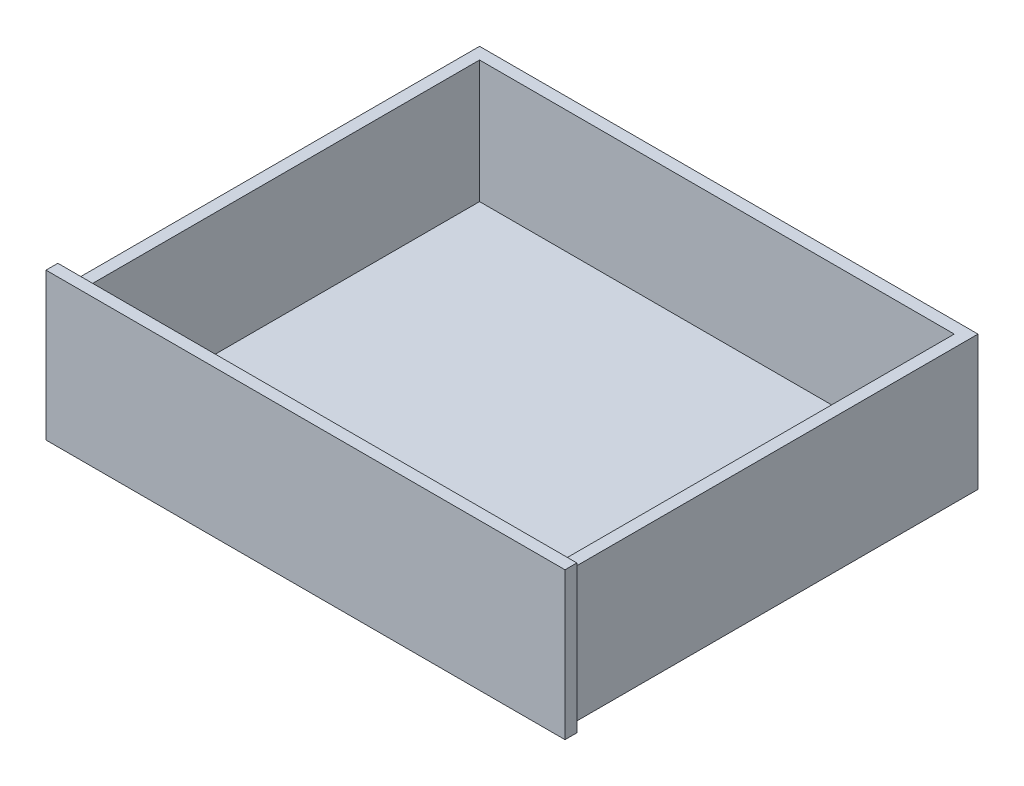
ISO-10303-21;
HEADER;
FILE_DESCRIPTION(('STEP AP214'),'2;1');
FILE_NAME('part.step','',(''),(''),'','','');
FILE_SCHEMA(('AUTOMOTIVE_DESIGN { 1 0 10303 214 1 1 1 1 }'));
ENDSEC;
DATA;
#1=APPLICATION_CONTEXT('core data for automotive mechanical design processes');
#2=APPLICATION_PROTOCOL_DEFINITION('international standard','automotive_design',2000,#1);
#3=PRODUCT_CONTEXT('',#1,'mechanical');
#4=PRODUCT('Part','Part','',(#3));
#5=PRODUCT_RELATED_PRODUCT_CATEGORY('part','',(#4));
#6=PRODUCT_DEFINITION_FORMATION('','',#4);
#7=PRODUCT_DEFINITION_CONTEXT('part definition',#1,'design');
#8=PRODUCT_DEFINITION('design','',#6,#7);
#9=PRODUCT_DEFINITION_SHAPE('','',#8);
#10=(LENGTH_UNIT() NAMED_UNIT(*) SI_UNIT(.MILLI.,.METRE.));
#11=(NAMED_UNIT(*) PLANE_ANGLE_UNIT() SI_UNIT($,.RADIAN.));
#12=(NAMED_UNIT(*) SI_UNIT($,.STERADIAN.) SOLID_ANGLE_UNIT());
#13=UNCERTAINTY_MEASURE_WITH_UNIT(LENGTH_MEASURE(1.E-05),#10,'distance_accuracy_value','');
#14=(GEOMETRIC_REPRESENTATION_CONTEXT(3) GLOBAL_UNCERTAINTY_ASSIGNED_CONTEXT((#13)) GLOBAL_UNIT_ASSIGNED_CONTEXT((#10,
#11,#12)) REPRESENTATION_CONTEXT('',''));
#15=CARTESIAN_POINT('',(0.,0.,0.));
#16=DIRECTION('',(0.,0.,1.));
#17=DIRECTION('',(1.,0.,0.));
#18=AXIS2_PLACEMENT_3D('',#15,#16,#17);
#19=CARTESIAN_POINT('',(0.,170.,0.));
#20=DIRECTION('',(0.,-1.,0.));
#21=DIRECTION('',(0.,0.,-1.));
#22=AXIS2_PLACEMENT_3D('',#19,#20,#21);
#23=PLANE('',#22);
#24=DIRECTION('',(0.,0.,-1.));
#25=VECTOR('',#24,1.);
#26=CARTESIAN_POINT('',(315.,170.,260.));
#27=LINE('',#26,#25);
#28=CARTESIAN_POINT('',(315.,170.,260.));
#29=VERTEX_POINT('',#28);
#30=CARTESIAN_POINT('',(315.,170.,-260.));
#31=VERTEX_POINT('',#30);
#32=EDGE_CURVE('E191',#29,#31,#27,.T.);
#33=ORIENTED_EDGE('',*,*,#32,.T.);
#34=DIRECTION('',(-1.,0.,0.));
#35=VECTOR('',#34,1.);
#36=CARTESIAN_POINT('',(-315.,170.,-260.));
#37=LINE('',#36,#35);
#38=CARTESIAN_POINT('',(-315.,170.,-260.));
#39=VERTEX_POINT('',#38);
#40=EDGE_CURVE('E82',#31,#39,#37,.T.);
#41=ORIENTED_EDGE('',*,*,#40,.T.);
#42=DIRECTION('',(0.,0.,1.));
#43=VECTOR('',#42,1.);
#44=CARTESIAN_POINT('',(-315.,170.,260.));
#45=LINE('',#44,#43);
#46=CARTESIAN_POINT('',(-315.,170.,260.));
#47=VERTEX_POINT('',#46);
#48=EDGE_CURVE('E195',#39,#47,#45,.T.);
#49=ORIENTED_EDGE('',*,*,#48,.T.);
#50=DIRECTION('',(1.,0.,0.));
#51=VECTOR('',#50,1.);
#52=CARTESIAN_POINT('',(-315.,170.,260.));
#53=LINE('',#52,#51);
#54=EDGE_CURVE('E57',#47,#29,#53,.T.);
#55=ORIENTED_EDGE('',*,*,#54,.T.);
#56=EDGE_LOOP('',(#33,#41,#49,#55));
#57=FACE_BOUND('',#56,.T.);
#58=DIRECTION('',(0.,0.,-1.));
#59=VECTOR('',#58,1.);
#60=CARTESIAN_POINT('',(300.,170.,0.));
#61=LINE('',#60,#59);
#62=CARTESIAN_POINT('',(300.,170.,245.));
#63=VERTEX_POINT('',#62);
#64=CARTESIAN_POINT('',(300.,170.,-245.));
#65=VERTEX_POINT('',#64);
#66=EDGE_CURVE('E184',#63,#65,#61,.T.);
#67=ORIENTED_EDGE('',*,*,#66,.F.);
#68=DIRECTION('',(1.,0.,0.));
#69=VECTOR('',#68,1.);
#70=CARTESIAN_POINT('',(0.,170.,245.));
#71=LINE('',#70,#69);
#72=CARTESIAN_POINT('',(-300.,170.,245.));
#73=VERTEX_POINT('',#72);
#74=EDGE_CURVE('E175',#73,#63,#71,.T.);
#75=ORIENTED_EDGE('',*,*,#74,.F.);
#76=DIRECTION('',(0.,0.,1.));
#77=VECTOR('',#76,1.);
#78=CARTESIAN_POINT('',(-300.,170.,0.));
#79=LINE('',#78,#77);
#80=CARTESIAN_POINT('',(-300.,170.,-245.));
#81=VERTEX_POINT('',#80);
#82=EDGE_CURVE('E188',#81,#73,#79,.T.);
#83=ORIENTED_EDGE('',*,*,#82,.F.);
#84=DIRECTION('',(-1.,0.,0.));
#85=VECTOR('',#84,1.);
#86=CARTESIAN_POINT('',(0.,170.,-245.));
#87=LINE('',#86,#85);
#88=EDGE_CURVE('E186',#65,#81,#87,.T.);
#89=ORIENTED_EDGE('',*,*,#88,.F.);
#90=EDGE_LOOP('',(#67,#75,#83,#89));
#91=FACE_BOUND('',#90,.T.);
#92=ADVANCED_FACE('F33',(#57,#91),#23,.F.);
#93=CARTESIAN_POINT('',(315.,170.,260.));
#94=DIRECTION('',(-1.,0.,0.));
#95=DIRECTION('',(0.,0.,1.));
#96=AXIS2_PLACEMENT_3D('',#93,#94,#95);
#97=PLANE('',#96);
#98=DIRECTION('',(0.,0.,-1.));
#99=VECTOR('',#98,1.);
#100=CARTESIAN_POINT('',(315.,0.,260.));
#101=LINE('',#100,#99);
#102=CARTESIAN_POINT('',(315.,0.,260.));
#103=VERTEX_POINT('',#102);
#104=CARTESIAN_POINT('',(315.,0.,-260.));
#105=VERTEX_POINT('',#104);
#106=EDGE_CURVE('E170',#103,#105,#101,.T.);
#107=ORIENTED_EDGE('',*,*,#106,.T.);
#108=DIRECTION('',(0.,-1.,0.));
#109=VECTOR('',#108,1.);
#110=CARTESIAN_POINT('',(315.,170.,-260.));
#111=LINE('',#110,#109);
#112=EDGE_CURVE('E11',#31,#105,#111,.T.);
#113=ORIENTED_EDGE('',*,*,#112,.F.);
#114=ORIENTED_EDGE('',*,*,#32,.F.);
#115=DIRECTION('',(0.,-1.,0.));
#116=VECTOR('',#115,1.);
#117=CARTESIAN_POINT('',(315.,170.,260.));
#118=LINE('',#117,#116);
#119=EDGE_CURVE('E75',#29,#103,#118,.T.);
#120=ORIENTED_EDGE('',*,*,#119,.T.);
#121=EDGE_LOOP('',(#107,#113,#114,#120));
#122=FACE_BOUND('',#121,.T.);
#123=ADVANCED_FACE('F35',(#122),#97,.F.);
#124=CARTESIAN_POINT('',(-315.,170.,-260.));
#125=DIRECTION('',(0.,0.,1.));
#126=DIRECTION('',(1.,0.,0.));
#127=AXIS2_PLACEMENT_3D('',#124,#125,#126);
#128=PLANE('',#127);
#129=DIRECTION('',(-1.,0.,0.));
#130=VECTOR('',#129,1.);
#131=CARTESIAN_POINT('',(-315.,0.,-260.));
#132=LINE('',#131,#130);
#133=CARTESIAN_POINT('',(-315.,0.,-260.));
#134=VERTEX_POINT('',#133);
#135=EDGE_CURVE('E199',#105,#134,#132,.T.);
#136=ORIENTED_EDGE('',*,*,#135,.T.);
#137=DIRECTION('',(0.,-1.,0.));
#138=VECTOR('',#137,1.);
#139=CARTESIAN_POINT('',(-315.,170.,-260.));
#140=LINE('',#139,#138);
#141=EDGE_CURVE('E41',#39,#134,#140,.T.);
#142=ORIENTED_EDGE('',*,*,#141,.F.);
#143=ORIENTED_EDGE('',*,*,#40,.F.);
#144=ORIENTED_EDGE('',*,*,#112,.T.);
#145=EDGE_LOOP('',(#136,#142,#143,#144));
#146=FACE_BOUND('',#145,.T.);
#147=ADVANCED_FACE('F247',(#146),#128,.F.);
#148=CARTESIAN_POINT('',(-315.,170.,260.));
#149=DIRECTION('',(1.,0.,0.));
#150=DIRECTION('',(0.,0.,-1.));
#151=AXIS2_PLACEMENT_3D('',#148,#149,#150);
#152=PLANE('',#151);
#153=DIRECTION('',(0.,0.,1.));
#154=VECTOR('',#153,1.);
#155=CARTESIAN_POINT('',(-315.,0.,260.));
#156=LINE('',#155,#154);
#157=CARTESIAN_POINT('',(-315.,0.,260.));
#158=VERTEX_POINT('',#157);
#159=EDGE_CURVE('E193',#134,#158,#156,.T.);
#160=ORIENTED_EDGE('',*,*,#159,.T.);
#161=DIRECTION('',(0.,-1.,0.));
#162=VECTOR('',#161,1.);
#163=CARTESIAN_POINT('',(-315.,170.,260.));
#164=LINE('',#163,#162);
#165=EDGE_CURVE('E203',#47,#158,#164,.T.);
#166=ORIENTED_EDGE('',*,*,#165,.F.);
#167=ORIENTED_EDGE('',*,*,#48,.F.);
#168=ORIENTED_EDGE('',*,*,#141,.T.);
#169=EDGE_LOOP('',(#160,#166,#167,#168));
#170=FACE_BOUND('',#169,.T.);
#171=ADVANCED_FACE('F209',(#170),#152,.F.);
#172=CARTESIAN_POINT('',(0.,0.,0.));
#173=DIRECTION('',(0.,-1.,0.));
#174=DIRECTION('',(0.,0.,-1.));
#175=AXIS2_PLACEMENT_3D('',#172,#173,#174);
#176=PLANE('',#175);
#177=ORIENTED_EDGE('',*,*,#106,.F.);
#178=DIRECTION('',(1.,0.,0.));
#179=VECTOR('',#178,1.);
#180=CARTESIAN_POINT('',(-328.,0.,260.));
#181=LINE('',#180,#179);
#182=CARTESIAN_POINT('',(328.,0.,260.));
#183=VERTEX_POINT('',#182);
#184=EDGE_CURVE('E214',#103,#183,#181,.T.);
#185=ORIENTED_EDGE('',*,*,#184,.T.);
#186=DIRECTION('',(0.,0.,-1.));
#187=VECTOR('',#186,1.);
#188=CARTESIAN_POINT('',(328.,0.,275.));
#189=LINE('',#188,#187);
#190=CARTESIAN_POINT('',(328.,0.,275.));
#191=VERTEX_POINT('',#190);
#192=EDGE_CURVE('E140',#191,#183,#189,.T.);
#193=ORIENTED_EDGE('',*,*,#192,.F.);
#194=DIRECTION('',(1.,0.,0.));
#195=VECTOR('',#194,1.);
#196=CARTESIAN_POINT('',(-328.,0.,275.));
#197=LINE('',#196,#195);
#198=CARTESIAN_POINT('',(-328.,0.,275.));
#199=VERTEX_POINT('',#198);
#200=EDGE_CURVE('E132',#199,#191,#197,.T.);
#201=ORIENTED_EDGE('',*,*,#200,.F.);
#202=DIRECTION('',(0.,0.,-1.));
#203=VECTOR('',#202,1.);
#204=CARTESIAN_POINT('',(-328.,0.,275.));
#205=LINE('',#204,#203);
#206=CARTESIAN_POINT('',(-328.,0.,260.));
#207=VERTEX_POINT('',#206);
#208=EDGE_CURVE('E137',#199,#207,#205,.T.);
#209=ORIENTED_EDGE('',*,*,#208,.T.);
#210=EDGE_CURVE('E211',#207,#158,#181,.T.);
#211=ORIENTED_EDGE('',*,*,#210,.T.);
#212=ORIENTED_EDGE('',*,*,#159,.F.);
#213=ORIENTED_EDGE('',*,*,#135,.F.);
#214=EDGE_LOOP('',(#177,#185,#193,#201,#209,#211,#212,#213));
#215=FACE_BOUND('',#214,.T.);
#216=ADVANCED_FACE('F134',(#215),#176,.T.);
#217=CARTESIAN_POINT('',(300.,170.,260.));
#218=DIRECTION('',(-1.,0.,0.));
#219=DIRECTION('',(0.,0.,1.));
#220=AXIS2_PLACEMENT_3D('',#217,#218,#219);
#221=PLANE('',#220);
#222=DIRECTION('',(0.,0.,-1.));
#223=VECTOR('',#222,1.);
#224=CARTESIAN_POINT('',(300.,15.,0.));
#225=LINE('',#224,#223);
#226=CARTESIAN_POINT('',(300.,15.,245.));
#227=VERTEX_POINT('',#226);
#228=CARTESIAN_POINT('',(300.,15.,-245.));
#229=VERTEX_POINT('',#228);
#230=EDGE_CURVE('E158',#227,#229,#225,.T.);
#231=ORIENTED_EDGE('',*,*,#230,.F.);
#232=DIRECTION('',(0.,-1.,0.));
#233=VECTOR('',#232,1.);
#234=CARTESIAN_POINT('',(300.,170.,245.));
#235=LINE('',#234,#233);
#236=EDGE_CURVE('E172',#63,#227,#235,.T.);
#237=ORIENTED_EDGE('',*,*,#236,.F.);
#238=ORIENTED_EDGE('',*,*,#66,.T.);
#239=DIRECTION('',(0.,-1.,0.));
#240=VECTOR('',#239,1.);
#241=CARTESIAN_POINT('',(300.,170.,-245.));
#242=LINE('',#241,#240);
#243=EDGE_CURVE('E167',#65,#229,#242,.T.);
#244=ORIENTED_EDGE('',*,*,#243,.T.);
#245=EDGE_LOOP('',(#231,#237,#238,#244));
#246=FACE_BOUND('',#245,.T.);
#247=ADVANCED_FACE('F254',(#246),#221,.T.);
#248=CARTESIAN_POINT('',(-315.,170.,-245.));
#249=DIRECTION('',(0.,0.,1.));
#250=DIRECTION('',(1.,0.,0.));
#251=AXIS2_PLACEMENT_3D('',#248,#249,#250);
#252=PLANE('',#251);
#253=DIRECTION('',(-1.,0.,0.));
#254=VECTOR('',#253,1.);
#255=CARTESIAN_POINT('',(0.,15.,-245.));
#256=LINE('',#255,#254);
#257=CARTESIAN_POINT('',(-300.,15.,-245.));
#258=VERTEX_POINT('',#257);
#259=EDGE_CURVE('E161',#229,#258,#256,.T.);
#260=ORIENTED_EDGE('',*,*,#259,.F.);
#261=ORIENTED_EDGE('',*,*,#243,.F.);
#262=ORIENTED_EDGE('',*,*,#88,.T.);
#263=DIRECTION('',(0.,-1.,0.));
#264=VECTOR('',#263,1.);
#265=CARTESIAN_POINT('',(-300.,170.,-245.));
#266=LINE('',#265,#264);
#267=EDGE_CURVE('E171',#81,#258,#266,.T.);
#268=ORIENTED_EDGE('',*,*,#267,.T.);
#269=EDGE_LOOP('',(#260,#261,#262,#268));
#270=FACE_BOUND('',#269,.T.);
#271=ADVANCED_FACE('F277',(#270),#252,.T.);
#272=CARTESIAN_POINT('',(-300.,170.,260.));
#273=DIRECTION('',(1.,0.,0.));
#274=DIRECTION('',(0.,0.,-1.));
#275=AXIS2_PLACEMENT_3D('',#272,#273,#274);
#276=PLANE('',#275);
#277=DIRECTION('',(0.,0.,1.));
#278=VECTOR('',#277,1.);
#279=CARTESIAN_POINT('',(-300.,15.,0.));
#280=LINE('',#279,#278);
#281=CARTESIAN_POINT('',(-300.,15.,245.));
#282=VERTEX_POINT('',#281);
#283=EDGE_CURVE('E177',#258,#282,#280,.T.);
#284=ORIENTED_EDGE('',*,*,#283,.F.);
#285=ORIENTED_EDGE('',*,*,#267,.F.);
#286=ORIENTED_EDGE('',*,*,#82,.T.);
#287=DIRECTION('',(0.,-1.,0.));
#288=VECTOR('',#287,1.);
#289=CARTESIAN_POINT('',(-300.,170.,245.));
#290=LINE('',#289,#288);
#291=EDGE_CURVE('E48',#73,#282,#290,.T.);
#292=ORIENTED_EDGE('',*,*,#291,.T.);
#293=EDGE_LOOP('',(#284,#285,#286,#292));
#294=FACE_BOUND('',#293,.T.);
#295=ADVANCED_FACE('F285',(#294),#276,.T.);
#296=CARTESIAN_POINT('',(-315.,170.,245.));
#297=DIRECTION('',(0.,0.,-1.));
#298=DIRECTION('',(-1.,0.,0.));
#299=AXIS2_PLACEMENT_3D('',#296,#297,#298);
#300=PLANE('',#299);
#301=DIRECTION('',(1.,0.,0.));
#302=VECTOR('',#301,1.);
#303=CARTESIAN_POINT('',(0.,15.,245.));
#304=LINE('',#303,#302);
#305=EDGE_CURVE('E181',#282,#227,#304,.T.);
#306=ORIENTED_EDGE('',*,*,#305,.F.);
#307=ORIENTED_EDGE('',*,*,#291,.F.);
#308=ORIENTED_EDGE('',*,*,#74,.T.);
#309=ORIENTED_EDGE('',*,*,#236,.T.);
#310=EDGE_LOOP('',(#306,#307,#308,#309));
#311=FACE_BOUND('',#310,.T.);
#312=ADVANCED_FACE('F293',(#311),#300,.T.);
#313=CARTESIAN_POINT('',(0.,15.,0.));
#314=DIRECTION('',(0.,-1.,0.));
#315=DIRECTION('',(0.,0.,-1.));
#316=AXIS2_PLACEMENT_3D('',#313,#314,#315);
#317=PLANE('',#316);
#318=ORIENTED_EDGE('',*,*,#230,.T.);
#319=ORIENTED_EDGE('',*,*,#259,.T.);
#320=ORIENTED_EDGE('',*,*,#283,.T.);
#321=ORIENTED_EDGE('',*,*,#305,.T.);
#322=EDGE_LOOP('',(#318,#319,#320,#321));
#323=FACE_BOUND('',#322,.T.);
#324=ADVANCED_FACE('F240',(#323),#317,.F.);
#325=CARTESIAN_POINT('',(-328.,186.,275.));
#326=DIRECTION('',(1.,0.,0.));
#327=DIRECTION('',(0.,0.,-1.));
#328=AXIS2_PLACEMENT_3D('',#325,#326,#327);
#329=PLANE('',#328);
#330=DIRECTION('',(0.,-1.,0.));
#331=VECTOR('',#330,1.);
#332=CARTESIAN_POINT('',(-328.,186.,260.));
#333=LINE('',#332,#331);
#334=CARTESIAN_POINT('',(-328.,186.,260.));
#335=VERTEX_POINT('',#334);
#336=EDGE_CURVE('E157',#335,#207,#333,.T.);
#337=ORIENTED_EDGE('',*,*,#336,.T.);
#338=ORIENTED_EDGE('',*,*,#208,.F.);
#339=DIRECTION('',(0.,-1.,0.));
#340=VECTOR('',#339,1.);
#341=CARTESIAN_POINT('',(-328.,186.,275.));
#342=LINE('',#341,#340);
#343=CARTESIAN_POINT('',(-328.,186.,275.));
#344=VERTEX_POINT('',#343);
#345=EDGE_CURVE('E144',#344,#199,#342,.T.);
#346=ORIENTED_EDGE('',*,*,#345,.F.);
#347=DIRECTION('',(0.,0.,-1.));
#348=VECTOR('',#347,1.);
#349=CARTESIAN_POINT('',(-328.,186.,275.));
#350=LINE('',#349,#348);
#351=EDGE_CURVE('E221',#344,#335,#350,.T.);
#352=ORIENTED_EDGE('',*,*,#351,.T.);
#353=EDGE_LOOP('',(#337,#338,#346,#352));
#354=FACE_BOUND('',#353,.T.);
#355=ADVANCED_FACE('F155',(#354),#329,.F.);
#356=CARTESIAN_POINT('',(328.,186.,275.));
#357=DIRECTION('',(-1.,0.,0.));
#358=DIRECTION('',(0.,0.,1.));
#359=AXIS2_PLACEMENT_3D('',#356,#357,#358);
#360=PLANE('',#359);
#361=DIRECTION('',(0.,1.,0.));
#362=VECTOR('',#361,1.);
#363=CARTESIAN_POINT('',(328.,186.,260.));
#364=LINE('',#363,#362);
#365=CARTESIAN_POINT('',(328.,186.,260.));
#366=VERTEX_POINT('',#365);
#367=EDGE_CURVE('E213',#183,#366,#364,.T.);
#368=ORIENTED_EDGE('',*,*,#367,.T.);
#369=DIRECTION('',(0.,0.,-1.));
#370=VECTOR('',#369,1.);
#371=CARTESIAN_POINT('',(328.,186.,275.));
#372=LINE('',#371,#370);
#373=CARTESIAN_POINT('',(328.,186.,275.));
#374=VERTEX_POINT('',#373);
#375=EDGE_CURVE('E163',#374,#366,#372,.T.);
#376=ORIENTED_EDGE('',*,*,#375,.F.);
#377=DIRECTION('',(0.,1.,0.));
#378=VECTOR('',#377,1.);
#379=CARTESIAN_POINT('',(328.,186.,275.));
#380=LINE('',#379,#378);
#381=EDGE_CURVE('E143',#191,#374,#380,.T.);
#382=ORIENTED_EDGE('',*,*,#381,.F.);
#383=ORIENTED_EDGE('',*,*,#192,.T.);
#384=EDGE_LOOP('',(#368,#376,#382,#383));
#385=FACE_BOUND('',#384,.T.);
#386=ADVANCED_FACE('F231',(#385),#360,.F.);
#387=CARTESIAN_POINT('',(-328.,186.,275.));
#388=DIRECTION('',(0.,-1.,0.));
#389=DIRECTION('',(0.,0.,-1.));
#390=AXIS2_PLACEMENT_3D('',#387,#388,#389);
#391=PLANE('',#390);
#392=DIRECTION('',(-1.,0.,0.));
#393=VECTOR('',#392,1.);
#394=CARTESIAN_POINT('',(-328.,186.,260.));
#395=LINE('',#394,#393);
#396=EDGE_CURVE('E153',#366,#335,#395,.T.);
#397=ORIENTED_EDGE('',*,*,#396,.T.);
#398=ORIENTED_EDGE('',*,*,#351,.F.);
#399=DIRECTION('',(-1.,0.,0.));
#400=VECTOR('',#399,1.);
#401=CARTESIAN_POINT('',(-328.,186.,275.));
#402=LINE('',#401,#400);
#403=EDGE_CURVE('E149',#374,#344,#402,.T.);
#404=ORIENTED_EDGE('',*,*,#403,.F.);
#405=ORIENTED_EDGE('',*,*,#375,.T.);
#406=EDGE_LOOP('',(#397,#398,#404,#405));
#407=FACE_BOUND('',#406,.T.);
#408=ADVANCED_FACE('F226',(#407),#391,.F.);
#409=CARTESIAN_POINT('',(0.,0.,275.));
#410=DIRECTION('',(0.,0.,1.));
#411=DIRECTION('',(1.,0.,0.));
#412=AXIS2_PLACEMENT_3D('',#409,#410,#411);
#413=PLANE('',#412);
#414=ORIENTED_EDGE('',*,*,#345,.T.);
#415=ORIENTED_EDGE('',*,*,#200,.T.);
#416=ORIENTED_EDGE('',*,*,#381,.T.);
#417=ORIENTED_EDGE('',*,*,#403,.T.);
#418=EDGE_LOOP('',(#414,#415,#416,#417));
#419=FACE_BOUND('',#418,.T.);
#420=ADVANCED_FACE('F147',(#419),#413,.T.);
#421=CARTESIAN_POINT('',(0.,0.,260.));
#422=DIRECTION('',(0.,0.,1.));
#423=DIRECTION('',(1.,0.,0.));
#424=AXIS2_PLACEMENT_3D('',#421,#422,#423);
#425=PLANE('',#424);
#426=ORIENTED_EDGE('',*,*,#119,.F.);
#427=ORIENTED_EDGE('',*,*,#54,.F.);
#428=ORIENTED_EDGE('',*,*,#165,.T.);
#429=ORIENTED_EDGE('',*,*,#210,.F.);
#430=ORIENTED_EDGE('',*,*,#336,.F.);
#431=ORIENTED_EDGE('',*,*,#396,.F.);
#432=ORIENTED_EDGE('',*,*,#367,.F.);
#433=ORIENTED_EDGE('',*,*,#184,.F.);
#434=EDGE_LOOP('',(#426,#427,#428,#429,#430,#431,#432,#433));
#435=FACE_BOUND('',#434,.T.);
#436=ADVANCED_FACE('F229',(#435),#425,.F.);
#437=CLOSED_SHELL('',(#92,#123,#147,#171,#216,#247,#271,#295,#312,#324,#355,#386,#408,#420,#436));
#438=MANIFOLD_SOLID_BREP('B2',#437);
#439=ADVANCED_BREP_SHAPE_REPRESENTATION('',(#18,#438),#14);
#440=SHAPE_DEFINITION_REPRESENTATION(#9,#439);
ENDSEC;
END-ISO-10303-21;
